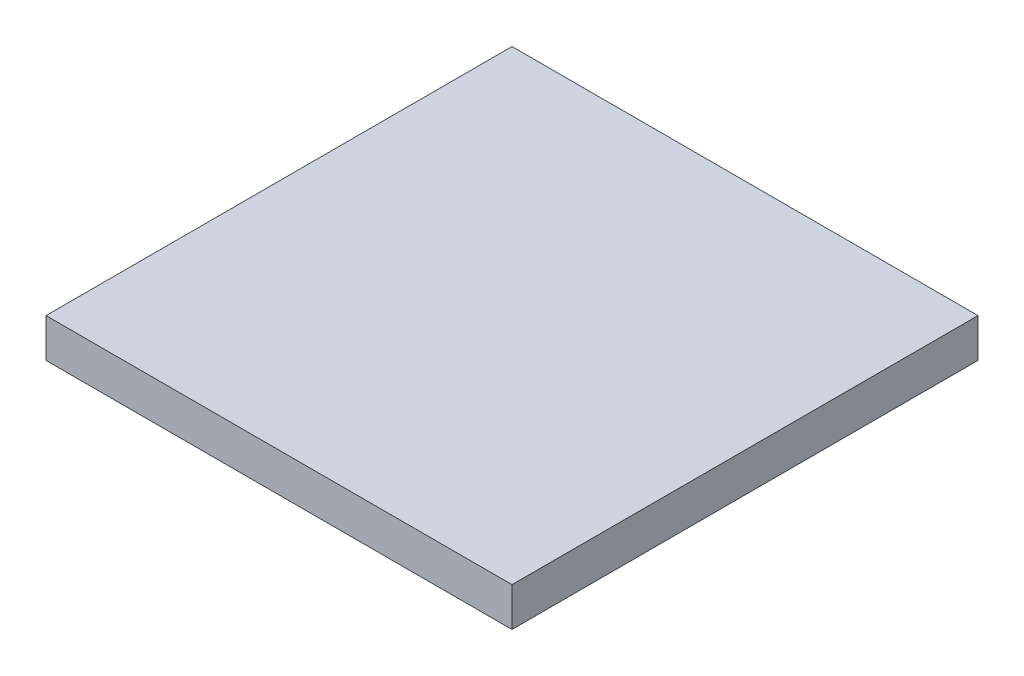
ISO-10303-21;
HEADER;
FILE_DESCRIPTION(('STEP AP214'),'2;1');
FILE_NAME('part.step','',(''),(''),'','','');
FILE_SCHEMA(('AUTOMOTIVE_DESIGN { 1 0 10303 214 1 1 1 1 }'));
ENDSEC;
DATA;
#1=APPLICATION_CONTEXT('core data for automotive mechanical design processes');
#2=APPLICATION_PROTOCOL_DEFINITION('international standard','automotive_design',2000,#1);
#3=PRODUCT_CONTEXT('',#1,'mechanical');
#4=PRODUCT('Part','Part','',(#3));
#5=PRODUCT_RELATED_PRODUCT_CATEGORY('part','',(#4));
#6=PRODUCT_DEFINITION_FORMATION('','',#4);
#7=PRODUCT_DEFINITION_CONTEXT('part definition',#1,'design');
#8=PRODUCT_DEFINITION('design','',#6,#7);
#9=PRODUCT_DEFINITION_SHAPE('','',#8);
#10=(LENGTH_UNIT() NAMED_UNIT(*) SI_UNIT(.MILLI.,.METRE.));
#11=(NAMED_UNIT(*) PLANE_ANGLE_UNIT() SI_UNIT($,.RADIAN.));
#12=(NAMED_UNIT(*) SI_UNIT($,.STERADIAN.) SOLID_ANGLE_UNIT());
#13=UNCERTAINTY_MEASURE_WITH_UNIT(LENGTH_MEASURE(1.E-05),#10,'distance_accuracy_value','');
#14=(GEOMETRIC_REPRESENTATION_CONTEXT(3) GLOBAL_UNCERTAINTY_ASSIGNED_CONTEXT((#13)) GLOBAL_UNIT_ASSIGNED_CONTEXT((#10,
#11,#12)) REPRESENTATION_CONTEXT('',''));
#15=CARTESIAN_POINT('',(0.,0.,0.));
#16=DIRECTION('',(0.,0.,1.));
#17=DIRECTION('',(1.,0.,0.));
#18=AXIS2_PLACEMENT_3D('',#15,#16,#17);
#19=CARTESIAN_POINT('',(0.,10.,0.));
#20=DIRECTION('',(1.,0.,0.));
#21=DIRECTION('',(0.,0.,-1.));
#22=AXIS2_PLACEMENT_3D('',#19,#20,#21);
#23=PLANE('',#22);
#24=DIRECTION('',(0.,0.,1.));
#25=VECTOR('',#24,1.);
#26=CARTESIAN_POINT('',(0.,0.,0.));
#27=LINE('',#26,#25);
#28=CARTESIAN_POINT('',(0.,0.,0.));
#29=VERTEX_POINT('',#28);
#30=CARTESIAN_POINT('',(0.,0.,120.));
#31=VERTEX_POINT('',#30);
#32=EDGE_CURVE('E96',#29,#31,#27,.T.);
#33=ORIENTED_EDGE('',*,*,#32,.T.);
#34=DIRECTION('',(0.,-1.,0.));
#35=VECTOR('',#34,1.);
#36=CARTESIAN_POINT('',(0.,10.,120.));
#37=LINE('',#36,#35);
#38=CARTESIAN_POINT('',(0.,10.,120.));
#39=VERTEX_POINT('',#38);
#40=EDGE_CURVE('E11',#39,#31,#37,.T.);
#41=ORIENTED_EDGE('',*,*,#40,.F.);
#42=DIRECTION('',(0.,0.,1.));
#43=VECTOR('',#42,1.);
#44=CARTESIAN_POINT('',(0.,10.,0.));
#45=LINE('',#44,#43);
#46=CARTESIAN_POINT('',(0.,10.,0.));
#47=VERTEX_POINT('',#46);
#48=EDGE_CURVE('E84',#47,#39,#45,.T.);
#49=ORIENTED_EDGE('',*,*,#48,.F.);
#50=DIRECTION('',(0.,-1.,0.));
#51=VECTOR('',#50,1.);
#52=CARTESIAN_POINT('',(0.,10.,0.));
#53=LINE('',#52,#51);
#54=EDGE_CURVE('E92',#47,#29,#53,.T.);
#55=ORIENTED_EDGE('',*,*,#54,.T.);
#56=EDGE_LOOP('',(#33,#41,#49,#55));
#57=FACE_BOUND('',#56,.T.);
#58=ADVANCED_FACE('F33',(#57),#23,.F.);
#59=CARTESIAN_POINT('',(0.,10.,120.));
#60=DIRECTION('',(0.,0.,-1.));
#61=DIRECTION('',(-1.,0.,0.));
#62=AXIS2_PLACEMENT_3D('',#59,#60,#61);
#63=PLANE('',#62);
#64=DIRECTION('',(1.,0.,0.));
#65=VECTOR('',#64,1.);
#66=CARTESIAN_POINT('',(0.,0.,120.));
#67=LINE('',#66,#65);
#68=CARTESIAN_POINT('',(120.,0.,120.));
#69=VERTEX_POINT('',#68);
#70=EDGE_CURVE('E88',#31,#69,#67,.T.);
#71=ORIENTED_EDGE('',*,*,#70,.T.);
#72=DIRECTION('',(0.,-1.,0.));
#73=VECTOR('',#72,1.);
#74=CARTESIAN_POINT('',(120.,10.,120.));
#75=LINE('',#74,#73);
#76=CARTESIAN_POINT('',(120.,10.,120.));
#77=VERTEX_POINT('',#76);
#78=EDGE_CURVE('E41',#77,#69,#75,.T.);
#79=ORIENTED_EDGE('',*,*,#78,.F.);
#80=DIRECTION('',(1.,0.,0.));
#81=VECTOR('',#80,1.);
#82=CARTESIAN_POINT('',(0.,10.,120.));
#83=LINE('',#82,#81);
#84=EDGE_CURVE('E79',#39,#77,#83,.T.);
#85=ORIENTED_EDGE('',*,*,#84,.F.);
#86=ORIENTED_EDGE('',*,*,#40,.T.);
#87=EDGE_LOOP('',(#71,#79,#85,#86));
#88=FACE_BOUND('',#87,.T.);
#89=ADVANCED_FACE('F87',(#88),#63,.F.);
#90=CARTESIAN_POINT('',(120.,10.,0.));
#91=DIRECTION('',(-1.,0.,0.));
#92=DIRECTION('',(0.,0.,1.));
#93=AXIS2_PLACEMENT_3D('',#90,#91,#92);
#94=PLANE('',#93);
#95=DIRECTION('',(0.,0.,-1.));
#96=VECTOR('',#95,1.);
#97=CARTESIAN_POINT('',(120.,0.,0.));
#98=LINE('',#97,#96);
#99=CARTESIAN_POINT('',(120.,0.,0.));
#100=VERTEX_POINT('',#99);
#101=EDGE_CURVE('E66',#69,#100,#98,.T.);
#102=ORIENTED_EDGE('',*,*,#101,.T.);
#103=DIRECTION('',(0.,-1.,0.));
#104=VECTOR('',#103,1.);
#105=CARTESIAN_POINT('',(120.,10.,0.));
#106=LINE('',#105,#104);
#107=CARTESIAN_POINT('',(120.,10.,0.));
#108=VERTEX_POINT('',#107);
#109=EDGE_CURVE('E89',#108,#100,#106,.T.);
#110=ORIENTED_EDGE('',*,*,#109,.F.);
#111=DIRECTION('',(0.,0.,-1.));
#112=VECTOR('',#111,1.);
#113=CARTESIAN_POINT('',(120.,10.,0.));
#114=LINE('',#113,#112);
#115=EDGE_CURVE('E82',#77,#108,#114,.T.);
#116=ORIENTED_EDGE('',*,*,#115,.F.);
#117=ORIENTED_EDGE('',*,*,#78,.T.);
#118=EDGE_LOOP('',(#102,#110,#116,#117));
#119=FACE_BOUND('',#118,.T.);
#120=ADVANCED_FACE('F90',(#119),#94,.F.);
#121=CARTESIAN_POINT('',(0.,10.,0.));
#122=DIRECTION('',(0.,0.,1.));
#123=DIRECTION('',(1.,0.,0.));
#124=AXIS2_PLACEMENT_3D('',#121,#122,#123);
#125=PLANE('',#124);
#126=DIRECTION('',(-1.,0.,0.));
#127=VECTOR('',#126,1.);
#128=CARTESIAN_POINT('',(0.,0.,0.));
#129=LINE('',#128,#127);
#130=EDGE_CURVE('E72',#100,#29,#129,.T.);
#131=ORIENTED_EDGE('',*,*,#130,.T.);
#132=ORIENTED_EDGE('',*,*,#54,.F.);
#133=DIRECTION('',(-1.,0.,0.));
#134=VECTOR('',#133,1.);
#135=CARTESIAN_POINT('',(0.,10.,0.));
#136=LINE('',#135,#134);
#137=EDGE_CURVE('E49',#108,#47,#136,.T.);
#138=ORIENTED_EDGE('',*,*,#137,.F.);
#139=ORIENTED_EDGE('',*,*,#109,.T.);
#140=EDGE_LOOP('',(#131,#132,#138,#139));
#141=FACE_BOUND('',#140,.T.);
#142=ADVANCED_FACE('F103',(#141),#125,.F.);
#143=CARTESIAN_POINT('',(0.,10.,0.));
#144=DIRECTION('',(0.,1.,0.));
#145=DIRECTION('',(0.,0.,1.));
#146=AXIS2_PLACEMENT_3D('',#143,#144,#145);
#147=PLANE('',#146);
#148=ORIENTED_EDGE('',*,*,#48,.T.);
#149=ORIENTED_EDGE('',*,*,#84,.T.);
#150=ORIENTED_EDGE('',*,*,#115,.T.);
#151=ORIENTED_EDGE('',*,*,#137,.T.);
#152=EDGE_LOOP('',(#148,#149,#150,#151));
#153=FACE_BOUND('',#152,.T.);
#154=ADVANCED_FACE('F80',(#153),#147,.T.);
#155=CARTESIAN_POINT('',(0.,0.,0.));
#156=DIRECTION('',(0.,1.,0.));
#157=DIRECTION('',(0.,0.,1.));
#158=AXIS2_PLACEMENT_3D('',#155,#156,#157);
#159=PLANE('',#158);
#160=ORIENTED_EDGE('',*,*,#32,.F.);
#161=ORIENTED_EDGE('',*,*,#130,.F.);
#162=ORIENTED_EDGE('',*,*,#101,.F.);
#163=ORIENTED_EDGE('',*,*,#70,.F.);
#164=EDGE_LOOP('',(#160,#161,#162,#163));
#165=FACE_BOUND('',#164,.T.);
#166=ADVANCED_FACE('F106',(#165),#159,.F.);
#167=CLOSED_SHELL('',(#58,#89,#120,#142,#154,#166));
#168=MANIFOLD_SOLID_BREP('B2',#167);
#169=ADVANCED_BREP_SHAPE_REPRESENTATION('',(#18,#168),#14);
#170=SHAPE_DEFINITION_REPRESENTATION(#9,#169);
ENDSEC;
END-ISO-10303-21;
